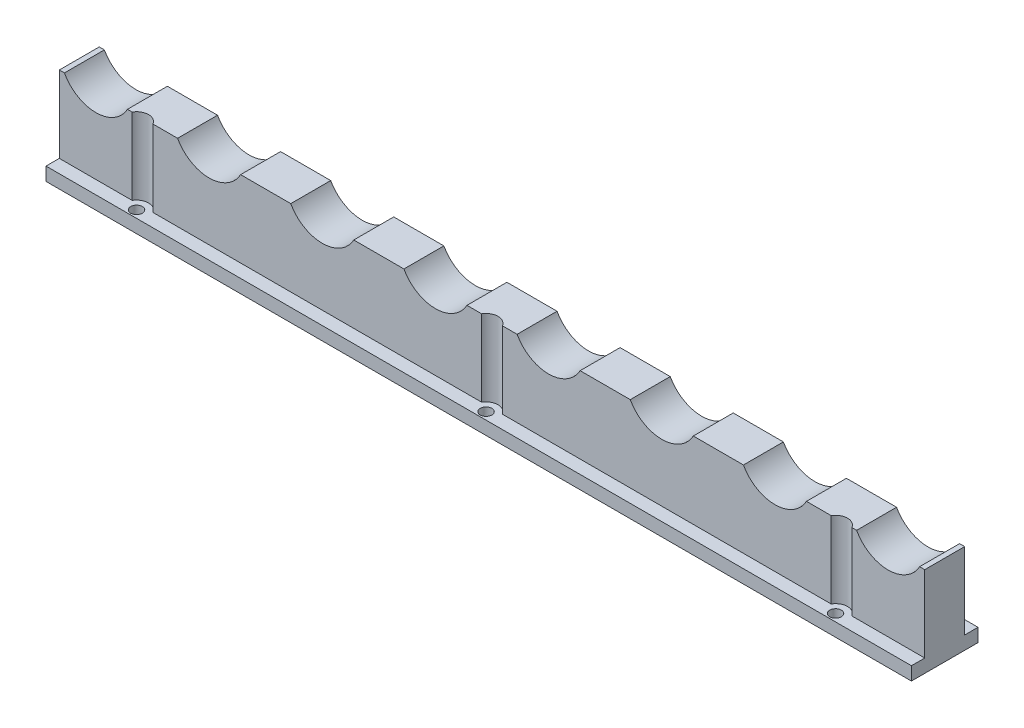
ISO-10303-21;
HEADER;
FILE_DESCRIPTION(('STEP AP214'),'2;1');
FILE_NAME('part.step','',(''),(''),'','','');
FILE_SCHEMA(('AUTOMOTIVE_DESIGN { 1 0 10303 214 1 1 1 1 }'));
ENDSEC;
DATA;
#1=APPLICATION_CONTEXT('core data for automotive mechanical design processes');
#2=APPLICATION_PROTOCOL_DEFINITION('international standard','automotive_design',2000,#1);
#3=PRODUCT_CONTEXT('',#1,'mechanical');
#4=PRODUCT('Part','Part','',(#3));
#5=PRODUCT_RELATED_PRODUCT_CATEGORY('part','',(#4));
#6=PRODUCT_DEFINITION_FORMATION('','',#4);
#7=PRODUCT_DEFINITION_CONTEXT('part definition',#1,'design');
#8=PRODUCT_DEFINITION('design','',#6,#7);
#9=PRODUCT_DEFINITION_SHAPE('','',#8);
#10=(LENGTH_UNIT() NAMED_UNIT(*) SI_UNIT(.MILLI.,.METRE.));
#11=(NAMED_UNIT(*) PLANE_ANGLE_UNIT() SI_UNIT($,.RADIAN.));
#12=(NAMED_UNIT(*) SI_UNIT($,.STERADIAN.) SOLID_ANGLE_UNIT());
#13=UNCERTAINTY_MEASURE_WITH_UNIT(LENGTH_MEASURE(1.E-05),#10,'distance_accuracy_value','');
#14=(GEOMETRIC_REPRESENTATION_CONTEXT(3) GLOBAL_UNCERTAINTY_ASSIGNED_CONTEXT((#13)) GLOBAL_UNIT_ASSIGNED_CONTEXT((#10,
#11,#12)) REPRESENTATION_CONTEXT('',''));
#15=CARTESIAN_POINT('',(0.,0.,0.));
#16=DIRECTION('',(0.,0.,1.));
#17=DIRECTION('',(1.,0.,0.));
#18=AXIS2_PLACEMENT_3D('',#15,#16,#17);
#19=CARTESIAN_POINT('',(0.,0.,30.));
#20=DIRECTION('',(0.,0.,-1.));
#21=DIRECTION('',(-1.,0.,0.));
#22=AXIS2_PLACEMENT_3D('',#19,#20,#21);
#23=PLANE('',#22);
#24=DIRECTION('',(1.,0.,0.));
#25=VECTOR('',#24,1.);
#26=CARTESIAN_POINT('',(-650.,20.,30.));
#27=LINE('',#26,#25);
#28=CARTESIAN_POINT('',(15.5884572681199,20.,30.));
#29=VERTEX_POINT('',#28);
#30=CARTESIAN_POINT('',(509.41154273188,20.,30.));
#31=VERTEX_POINT('',#30);
#32=EDGE_CURVE('E293',#29,#31,#27,.T.);
#33=ORIENTED_EDGE('',*,*,#32,.T.);
#34=DIRECTION('',(0.,1.,0.));
#35=VECTOR('',#34,1.);
#36=CARTESIAN_POINT('',(509.41154273188,135.,30.));
#37=LINE('',#36,#35);
#38=CARTESIAN_POINT('',(509.41154273188,135.,30.));
#39=VERTEX_POINT('',#38);
#40=EDGE_CURVE('E277',#31,#39,#37,.T.);
#41=ORIENTED_EDGE('',*,*,#40,.T.);
#42=DIRECTION('',(-1.,0.,0.));
#43=VECTOR('',#42,1.);
#44=CARTESIAN_POINT('',(-650.,135.,30.));
#45=LINE('',#44,#43);
#46=CARTESIAN_POINT('',(472.328638264797,135.,30.));
#47=VERTEX_POINT('',#46);
#48=EDGE_CURVE('E323',#39,#47,#45,.T.);
#49=ORIENTED_EDGE('',*,*,#48,.T.);
#50=CARTESIAN_POINT('',(425.,161.,30.));
#51=DIRECTION('',(0.,0.,-1.));
#52=DIRECTION('',(-1.,0.,0.));
#53=AXIS2_PLACEMENT_3D('',#50,#51,#52);
#54=CIRCLE('',#53,54.0000000000001);
#55=CARTESIAN_POINT('',(377.671361735203,135.,30.));
#56=VERTEX_POINT('',#55);
#57=EDGE_CURVE('E454',#47,#56,#54,.T.);
#58=ORIENTED_EDGE('',*,*,#57,.T.);
#59=CARTESIAN_POINT('',(302.328638264797,135.,30.));
#60=VERTEX_POINT('',#59);
#61=EDGE_CURVE('E576',#56,#60,#45,.T.);
#62=ORIENTED_EDGE('',*,*,#61,.T.);
#63=CARTESIAN_POINT('',(255.,161.,30.));
#64=DIRECTION('',(0.,0.,-1.));
#65=DIRECTION('',(-1.,0.,0.));
#66=AXIS2_PLACEMENT_3D('',#63,#64,#65);
#67=CIRCLE('',#66,54.0000000000001);
#68=CARTESIAN_POINT('',(207.671361735203,135.,30.));
#69=VERTEX_POINT('',#68);
#70=EDGE_CURVE('E459',#60,#69,#67,.T.);
#71=ORIENTED_EDGE('',*,*,#70,.T.);
#72=CARTESIAN_POINT('',(132.328638264797,135.,30.));
#73=VERTEX_POINT('',#72);
#74=EDGE_CURVE('E628',#69,#73,#45,.T.);
#75=ORIENTED_EDGE('',*,*,#74,.T.);
#76=CARTESIAN_POINT('',(85.0000000000001,161.,30.));
#77=DIRECTION('',(0.,0.,-1.));
#78=DIRECTION('',(-1.,0.,0.));
#79=AXIS2_PLACEMENT_3D('',#76,#77,#78);
#80=CIRCLE('',#79,54.0000000000001);
#81=CARTESIAN_POINT('',(37.6713617352031,135.,30.));
#82=VERTEX_POINT('',#81);
#83=EDGE_CURVE('E407',#73,#82,#80,.T.);
#84=ORIENTED_EDGE('',*,*,#83,.T.);
#85=CARTESIAN_POINT('',(15.5884572681199,135.,30.));
#86=VERTEX_POINT('',#85);
#87=EDGE_CURVE('E625',#82,#86,#45,.T.);
#88=ORIENTED_EDGE('',*,*,#87,.T.);
#89=DIRECTION('',(0.,1.,0.));
#90=VECTOR('',#89,1.);
#91=CARTESIAN_POINT('',(15.5884572681199,135.,30.));
#92=LINE('',#91,#90);
#93=EDGE_CURVE('E55',#86,#29,#92,.F.);
#94=ORIENTED_EDGE('',*,*,#93,.T.);
#95=EDGE_LOOP('',(#33,#41,#49,#58,#62,#71,#75,#84,#88,#94));
#96=FACE_BOUND('',#95,.T.);
#97=ADVANCED_FACE('F46',(#96),#23,.F.);
#98=CARTESIAN_POINT('',(-650.,20.,30.));
#99=DIRECTION('',(0.,-1.,0.));
#100=DIRECTION('',(1.,0.,0.));
#101=AXIS2_PLACEMENT_3D('',#98,#99,#100);
#102=PLANE('',#101);
#103=CARTESIAN_POINT('',(0.,20.,39.));
#104=DIRECTION('',(0.,1.,0.));
#105=DIRECTION('',(0.,0.,1.));
#106=AXIS2_PLACEMENT_3D('',#103,#104,#105);
#107=CIRCLE('',#106,8.74999999999998);
#108=CARTESIAN_POINT('',(0.,20.,47.75));
#109=VERTEX_POINT('',#108);
#110=EDGE_CURVE('E593',#109,#109,#107,.T.);
#111=ORIENTED_EDGE('',*,*,#110,.F.);
#112=EDGE_LOOP('',(#111));
#113=FACE_BOUND('',#112,.T.);
#114=CARTESIAN_POINT('',(-525.,20.,39.));
#115=DIRECTION('',(0.,1.,0.));
#116=DIRECTION('',(0.,0.,1.));
#117=AXIS2_PLACEMENT_3D('',#114,#115,#116);
#118=CIRCLE('',#117,8.74999999999993);
#119=CARTESIAN_POINT('',(-525.,20.,47.7499999999999));
#120=VERTEX_POINT('',#119);
#121=EDGE_CURVE('E488',#120,#120,#118,.T.);
#122=ORIENTED_EDGE('',*,*,#121,.F.);
#123=EDGE_LOOP('',(#122));
#124=FACE_BOUND('',#123,.T.);
#125=DIRECTION('',(1.,0.,0.));
#126=VECTOR('',#125,1.);
#127=CARTESIAN_POINT('',(-650.,20.,50.));
#128=LINE('',#127,#126);
#129=CARTESIAN_POINT('',(-650.,20.,50.));
#130=VERTEX_POINT('',#129);
#131=CARTESIAN_POINT('',(650.,20.,50.));
#132=VERTEX_POINT('',#131);
#133=EDGE_CURVE('E325',#130,#132,#128,.T.);
#134=ORIENTED_EDGE('',*,*,#133,.T.);
#135=DIRECTION('',(0.,0.,1.));
#136=VECTOR('',#135,1.);
#137=CARTESIAN_POINT('',(650.,20.,30.));
#138=LINE('',#137,#136);
#139=CARTESIAN_POINT('',(650.,20.,30.));
#140=VERTEX_POINT('',#139);
#141=EDGE_CURVE('E328',#140,#132,#138,.T.);
#142=ORIENTED_EDGE('',*,*,#141,.F.);
#143=CARTESIAN_POINT('',(540.58845726812,20.,30.));
#144=VERTEX_POINT('',#143);
#145=EDGE_CURVE('E295',#144,#140,#27,.T.);
#146=ORIENTED_EDGE('',*,*,#145,.F.);
#147=CARTESIAN_POINT('',(525.,20.,39.));
#148=DIRECTION('',(0.,1.,0.));
#149=DIRECTION('',(0.,0.,1.));
#150=AXIS2_PLACEMENT_3D('',#147,#148,#149);
#151=CIRCLE('',#150,18.);
#152=EDGE_CURVE('E65',#144,#31,#151,.T.);
#153=ORIENTED_EDGE('',*,*,#152,.T.);
#154=ORIENTED_EDGE('',*,*,#32,.F.);
#155=CARTESIAN_POINT('',(0.,20.,39.));
#156=DIRECTION('',(0.,1.,0.));
#157=DIRECTION('',(0.,0.,1.));
#158=AXIS2_PLACEMENT_3D('',#155,#156,#157);
#159=CIRCLE('',#158,18.);
#160=CARTESIAN_POINT('',(-15.5884572681199,20.,30.));
#161=VERTEX_POINT('',#160);
#162=EDGE_CURVE('E76',#29,#161,#159,.T.);
#163=ORIENTED_EDGE('',*,*,#162,.T.);
#164=CARTESIAN_POINT('',(-509.41154273188,20.,30.));
#165=VERTEX_POINT('',#164);
#166=EDGE_CURVE('E301',#165,#161,#27,.T.);
#167=ORIENTED_EDGE('',*,*,#166,.F.);
#168=CARTESIAN_POINT('',(-525.,20.,39.));
#169=DIRECTION('',(0.,1.,0.));
#170=DIRECTION('',(0.,0.,1.));
#171=AXIS2_PLACEMENT_3D('',#168,#169,#170);
#172=CIRCLE('',#171,18.);
#173=CARTESIAN_POINT('',(-540.58845726812,20.,30.));
#174=VERTEX_POINT('',#173);
#175=EDGE_CURVE('E485',#165,#174,#172,.T.);
#176=ORIENTED_EDGE('',*,*,#175,.T.);
#177=CARTESIAN_POINT('',(-650.,20.,30.));
#178=VERTEX_POINT('',#177);
#179=EDGE_CURVE('E307',#178,#174,#27,.T.);
#180=ORIENTED_EDGE('',*,*,#179,.F.);
#181=DIRECTION('',(0.,0.,1.));
#182=VECTOR('',#181,1.);
#183=CARTESIAN_POINT('',(-650.,20.,30.));
#184=LINE('',#183,#182);
#185=EDGE_CURVE('E321',#178,#130,#184,.T.);
#186=ORIENTED_EDGE('',*,*,#185,.T.);
#187=EDGE_LOOP('',(#134,#142,#146,#153,#154,#163,#167,#176,#180,#186));
#188=FACE_BOUND('',#187,.T.);
#189=CARTESIAN_POINT('',(525.,20.,39.));
#190=DIRECTION('',(0.,1.,0.));
#191=DIRECTION('',(0.,0.,1.));
#192=AXIS2_PLACEMENT_3D('',#189,#190,#191);
#193=CIRCLE('',#192,8.74999999999993);
#194=CARTESIAN_POINT('',(525.,20.,47.7499999999999));
#195=VERTEX_POINT('',#194);
#196=EDGE_CURVE('E297',#195,#195,#193,.T.);
#197=ORIENTED_EDGE('',*,*,#196,.F.);
#198=EDGE_LOOP('',(#197));
#199=FACE_BOUND('',#198,.T.);
#200=ADVANCED_FACE('F291',(#113,#124,#188,#199),#102,.F.);
#201=CARTESIAN_POINT('',(-650.,0.,-50.));
#202=DIRECTION('',(0.,-1.,0.));
#203=DIRECTION('',(0.,0.,-1.));
#204=AXIS2_PLACEMENT_3D('',#201,#202,#203);
#205=PLANE('',#204);
#206=CARTESIAN_POINT('',(525.,0.,39.));
#207=DIRECTION('',(0.,1.,0.));
#208=DIRECTION('',(0.,0.,1.));
#209=AXIS2_PLACEMENT_3D('',#206,#207,#208);
#210=CIRCLE('',#209,8.74999999999993);
#211=CARTESIAN_POINT('',(525.,0.,47.7499999999999));
#212=VERTEX_POINT('',#211);
#213=EDGE_CURVE('E572',#212,#212,#210,.T.);
#214=ORIENTED_EDGE('',*,*,#213,.T.);
#215=EDGE_LOOP('',(#214));
#216=FACE_BOUND('',#215,.T.);
#217=DIRECTION('',(1.,0.,0.));
#218=VECTOR('',#217,1.);
#219=CARTESIAN_POINT('',(-650.,0.,50.));
#220=LINE('',#219,#218);
#221=CARTESIAN_POINT('',(-650.,0.,50.));
#222=VERTEX_POINT('',#221);
#223=CARTESIAN_POINT('',(650.,0.,50.));
#224=VERTEX_POINT('',#223);
#225=EDGE_CURVE('E345',#222,#224,#220,.T.);
#226=ORIENTED_EDGE('',*,*,#225,.F.);
#227=DIRECTION('',(0.,0.,1.));
#228=VECTOR('',#227,1.);
#229=CARTESIAN_POINT('',(-650.,0.,-50.));
#230=LINE('',#229,#228);
#231=CARTESIAN_POINT('',(-650.,0.,-50.));
#232=VERTEX_POINT('',#231);
#233=EDGE_CURVE('E343',#232,#222,#230,.T.);
#234=ORIENTED_EDGE('',*,*,#233,.F.);
#235=DIRECTION('',(1.,0.,0.));
#236=VECTOR('',#235,1.);
#237=CARTESIAN_POINT('',(-650.,0.,-50.));
#238=LINE('',#237,#236);
#239=CARTESIAN_POINT('',(650.,0.,-50.));
#240=VERTEX_POINT('',#239);
#241=EDGE_CURVE('E335',#232,#240,#238,.T.);
#242=ORIENTED_EDGE('',*,*,#241,.T.);
#243=DIRECTION('',(0.,0.,1.));
#244=VECTOR('',#243,1.);
#245=CARTESIAN_POINT('',(650.,0.,-50.));
#246=LINE('',#245,#244);
#247=EDGE_CURVE('E358',#240,#224,#246,.T.);
#248=ORIENTED_EDGE('',*,*,#247,.T.);
#249=EDGE_LOOP('',(#226,#234,#242,#248));
#250=FACE_BOUND('',#249,.T.);
#251=CARTESIAN_POINT('',(-525.,0.,39.));
#252=DIRECTION('',(0.,1.,0.));
#253=DIRECTION('',(0.,0.,1.));
#254=AXIS2_PLACEMENT_3D('',#251,#252,#253);
#255=CIRCLE('',#254,8.74999999999993);
#256=CARTESIAN_POINT('',(-525.,0.,47.7499999999999));
#257=VERTEX_POINT('',#256);
#258=EDGE_CURVE('E491',#257,#257,#255,.T.);
#259=ORIENTED_EDGE('',*,*,#258,.T.);
#260=EDGE_LOOP('',(#259));
#261=FACE_BOUND('',#260,.T.);
#262=CARTESIAN_POINT('',(0.,0.,39.));
#263=DIRECTION('',(0.,1.,0.));
#264=DIRECTION('',(0.,0.,1.));
#265=AXIS2_PLACEMENT_3D('',#262,#263,#264);
#266=CIRCLE('',#265,8.74999999999997);
#267=CARTESIAN_POINT('',(0.,0.,47.75));
#268=VERTEX_POINT('',#267);
#269=EDGE_CURVE('E449',#268,#268,#266,.T.);
#270=ORIENTED_EDGE('',*,*,#269,.T.);
#271=EDGE_LOOP('',(#270));
#272=FACE_BOUND('',#271,.T.);
#273=ADVANCED_FACE('F533',(#216,#250,#261,#272),#205,.T.);
#274=ORIENTED_EDGE('',*,*,#166,.T.);
#275=DIRECTION('',(0.,1.,0.));
#276=VECTOR('',#275,1.);
#277=CARTESIAN_POINT('',(-15.5884572681199,135.,30.));
#278=LINE('',#277,#276);
#279=CARTESIAN_POINT('',(-15.5884572681199,135.,30.));
#280=VERTEX_POINT('',#279);
#281=EDGE_CURVE('E12',#161,#280,#278,.T.);
#282=ORIENTED_EDGE('',*,*,#281,.T.);
#283=CARTESIAN_POINT('',(-37.6713617352029,135.,30.));
#284=VERTEX_POINT('',#283);
#285=EDGE_CURVE('E579',#280,#284,#45,.T.);
#286=ORIENTED_EDGE('',*,*,#285,.T.);
#287=CARTESIAN_POINT('',(-85.,161.,30.));
#288=DIRECTION('',(0.,0.,-1.));
#289=DIRECTION('',(-1.,0.,0.));
#290=AXIS2_PLACEMENT_3D('',#287,#288,#289);
#291=CIRCLE('',#290,54.0000000000001);
#292=CARTESIAN_POINT('',(-132.328638264797,135.,30.));
#293=VERTEX_POINT('',#292);
#294=EDGE_CURVE('E403',#284,#293,#291,.T.);
#295=ORIENTED_EDGE('',*,*,#294,.T.);
#296=CARTESIAN_POINT('',(-207.671361735203,135.,30.));
#297=VERTEX_POINT('',#296);
#298=EDGE_CURVE('E614',#293,#297,#45,.T.);
#299=ORIENTED_EDGE('',*,*,#298,.T.);
#300=CARTESIAN_POINT('',(-255.,161.,30.));
#301=DIRECTION('',(0.,0.,-1.));
#302=DIRECTION('',(-1.,0.,0.));
#303=AXIS2_PLACEMENT_3D('',#300,#301,#302);
#304=CIRCLE('',#303,54.0000000000001);
#305=CARTESIAN_POINT('',(-302.328638264797,135.,30.));
#306=VERTEX_POINT('',#305);
#307=EDGE_CURVE('E406',#297,#306,#304,.T.);
#308=ORIENTED_EDGE('',*,*,#307,.T.);
#309=CARTESIAN_POINT('',(-377.671361735203,135.,30.));
#310=VERTEX_POINT('',#309);
#311=EDGE_CURVE('E624',#306,#310,#45,.T.);
#312=ORIENTED_EDGE('',*,*,#311,.T.);
#313=CARTESIAN_POINT('',(-425.,161.,30.));
#314=DIRECTION('',(0.,0.,-1.));
#315=DIRECTION('',(-1.,0.,0.));
#316=AXIS2_PLACEMENT_3D('',#313,#314,#315);
#317=CIRCLE('',#316,54.0000000000001);
#318=CARTESIAN_POINT('',(-472.328638264797,135.,30.));
#319=VERTEX_POINT('',#318);
#320=EDGE_CURVE('E468',#310,#319,#317,.T.);
#321=ORIENTED_EDGE('',*,*,#320,.T.);
#322=CARTESIAN_POINT('',(-509.41154273188,135.,30.));
#323=VERTEX_POINT('',#322);
#324=EDGE_CURVE('E626',#319,#323,#45,.T.);
#325=ORIENTED_EDGE('',*,*,#324,.T.);
#326=DIRECTION('',(0.,1.,0.));
#327=VECTOR('',#326,1.);
#328=CARTESIAN_POINT('',(-509.41154273188,135.,30.));
#329=LINE('',#328,#327);
#330=EDGE_CURVE('E354',#323,#165,#329,.F.);
#331=ORIENTED_EDGE('',*,*,#330,.T.);
#332=EDGE_LOOP('',(#274,#282,#286,#295,#299,#308,#312,#321,#325,#331));
#333=FACE_BOUND('',#332,.T.);
#334=ADVANCED_FACE('F619',(#333),#23,.F.);
#335=CARTESIAN_POINT('',(-650.,135.,-50.));
#336=DIRECTION('',(0.,1.,0.));
#337=DIRECTION('',(0.,0.,1.));
#338=AXIS2_PLACEMENT_3D('',#335,#336,#337);
#339=PLANE('',#338);
#340=DIRECTION('',(0.,0.,1.));
#341=VECTOR('',#340,1.);
#342=CARTESIAN_POINT('',(-472.328638264797,135.,-50.));
#343=LINE('',#342,#341);
#344=CARTESIAN_POINT('',(-472.328638264797,135.,-30.));
#345=VERTEX_POINT('',#344);
#346=EDGE_CURVE('E455',#345,#319,#343,.T.);
#347=ORIENTED_EDGE('',*,*,#346,.F.);
#348=DIRECTION('',(-1.,0.,0.));
#349=VECTOR('',#348,1.);
#350=CARTESIAN_POINT('',(-650.,135.,-30.));
#351=LINE('',#350,#349);
#352=CARTESIAN_POINT('',(-547.671361735203,135.,-30.));
#353=VERTEX_POINT('',#352);
#354=EDGE_CURVE('E506',#345,#353,#351,.T.);
#355=ORIENTED_EDGE('',*,*,#354,.T.);
#356=DIRECTION('',(0.,0.,1.));
#357=VECTOR('',#356,1.);
#358=CARTESIAN_POINT('',(-547.671361735203,135.,-50.));
#359=LINE('',#358,#357);
#360=CARTESIAN_POINT('',(-547.671361735203,135.,30.));
#361=VERTEX_POINT('',#360);
#362=EDGE_CURVE('E471',#353,#361,#359,.T.);
#363=ORIENTED_EDGE('',*,*,#362,.T.);
#364=CARTESIAN_POINT('',(-540.58845726812,135.,30.));
#365=VERTEX_POINT('',#364);
#366=EDGE_CURVE('E324',#365,#361,#45,.T.);
#367=ORIENTED_EDGE('',*,*,#366,.F.);
#368=CARTESIAN_POINT('',(-525.,135.,39.));
#369=DIRECTION('',(0.,1.,0.));
#370=DIRECTION('',(0.,0.,1.));
#371=AXIS2_PLACEMENT_3D('',#368,#369,#370);
#372=CIRCLE('',#371,18.);
#373=EDGE_CURVE('E482',#323,#365,#372,.T.);
#374=ORIENTED_EDGE('',*,*,#373,.F.);
#375=ORIENTED_EDGE('',*,*,#324,.F.);
#376=EDGE_LOOP('',(#347,#355,#363,#367,#374,#375));
#377=FACE_BOUND('',#376,.T.);
#378=ADVANCED_FACE('F664',(#377),#339,.T.);
#379=DIRECTION('',(0.,0.,1.));
#380=VECTOR('',#379,1.);
#381=CARTESIAN_POINT('',(-377.671361735203,135.,-50.));
#382=LINE('',#381,#380);
#383=CARTESIAN_POINT('',(-377.671361735203,135.,-30.));
#384=VERTEX_POINT('',#383);
#385=EDGE_CURVE('E566',#384,#310,#382,.T.);
#386=ORIENTED_EDGE('',*,*,#385,.T.);
#387=ORIENTED_EDGE('',*,*,#311,.F.);
#388=DIRECTION('',(0.,0.,1.));
#389=VECTOR('',#388,1.);
#390=CARTESIAN_POINT('',(-302.328638264797,135.,-50.));
#391=LINE('',#390,#389);
#392=CARTESIAN_POINT('',(-302.328638264797,135.,-30.));
#393=VERTEX_POINT('',#392);
#394=EDGE_CURVE('E603',#393,#306,#391,.T.);
#395=ORIENTED_EDGE('',*,*,#394,.F.);
#396=EDGE_CURVE('E565',#393,#384,#351,.T.);
#397=ORIENTED_EDGE('',*,*,#396,.T.);
#398=EDGE_LOOP('',(#386,#387,#395,#397));
#399=FACE_BOUND('',#398,.T.);
#400=ADVANCED_FACE('F658',(#399),#339,.T.);
#401=DIRECTION('',(0.,0.,1.));
#402=VECTOR('',#401,1.);
#403=CARTESIAN_POINT('',(-207.671361735203,135.,-50.));
#404=LINE('',#403,#402);
#405=CARTESIAN_POINT('',(-207.671361735203,135.,-30.));
#406=VERTEX_POINT('',#405);
#407=EDGE_CURVE('E418',#406,#297,#404,.T.);
#408=ORIENTED_EDGE('',*,*,#407,.T.);
#409=ORIENTED_EDGE('',*,*,#298,.F.);
#410=DIRECTION('',(0.,0.,1.));
#411=VECTOR('',#410,1.);
#412=CARTESIAN_POINT('',(-132.328638264797,135.,-50.));
#413=LINE('',#412,#411);
#414=CARTESIAN_POINT('',(-132.328638264797,135.,-30.));
#415=VERTEX_POINT('',#414);
#416=EDGE_CURVE('E411',#415,#293,#413,.T.);
#417=ORIENTED_EDGE('',*,*,#416,.F.);
#418=EDGE_CURVE('E616',#415,#406,#351,.T.);
#419=ORIENTED_EDGE('',*,*,#418,.T.);
#420=EDGE_LOOP('',(#408,#409,#417,#419));
#421=FACE_BOUND('',#420,.T.);
#422=ADVANCED_FACE('F612',(#421),#339,.T.);
#423=CARTESIAN_POINT('',(0.,135.,39.));
#424=DIRECTION('',(0.,1.,0.));
#425=DIRECTION('',(0.,0.,1.));
#426=AXIS2_PLACEMENT_3D('',#423,#424,#425);
#427=CIRCLE('',#426,18.);
#428=EDGE_CURVE('E285',#86,#280,#427,.T.);
#429=ORIENTED_EDGE('',*,*,#428,.F.);
#430=ORIENTED_EDGE('',*,*,#87,.F.);
#431=DIRECTION('',(0.,0.,1.));
#432=VECTOR('',#431,1.);
#433=CARTESIAN_POINT('',(37.6713617352031,135.,-50.));
#434=LINE('',#433,#432);
#435=CARTESIAN_POINT('',(37.6713617352031,135.,-30.));
#436=VERTEX_POINT('',#435);
#437=EDGE_CURVE('E412',#436,#82,#434,.T.);
#438=ORIENTED_EDGE('',*,*,#437,.F.);
#439=CARTESIAN_POINT('',(-37.6713617352029,135.,-30.));
#440=VERTEX_POINT('',#439);
#441=EDGE_CURVE('E401',#436,#440,#351,.T.);
#442=ORIENTED_EDGE('',*,*,#441,.T.);
#443=DIRECTION('',(0.,0.,1.));
#444=VECTOR('',#443,1.);
#445=CARTESIAN_POINT('',(-37.6713617352029,135.,-50.));
#446=LINE('',#445,#444);
#447=EDGE_CURVE('E409',#440,#284,#446,.T.);
#448=ORIENTED_EDGE('',*,*,#447,.T.);
#449=ORIENTED_EDGE('',*,*,#285,.F.);
#450=EDGE_LOOP('',(#429,#430,#438,#442,#448,#449));
#451=FACE_BOUND('',#450,.T.);
#452=ADVANCED_FACE('F737',(#451),#339,.T.);
#453=DIRECTION('',(0.,0.,1.));
#454=VECTOR('',#453,1.);
#455=CARTESIAN_POINT('',(132.328638264797,135.,-50.));
#456=LINE('',#455,#454);
#457=CARTESIAN_POINT('',(132.328638264797,135.,-30.));
#458=VERTEX_POINT('',#457);
#459=EDGE_CURVE('E421',#458,#73,#456,.T.);
#460=ORIENTED_EDGE('',*,*,#459,.T.);
#461=ORIENTED_EDGE('',*,*,#74,.F.);
#462=DIRECTION('',(0.,0.,1.));
#463=VECTOR('',#462,1.);
#464=CARTESIAN_POINT('',(207.671361735203,135.,-50.));
#465=LINE('',#464,#463);
#466=CARTESIAN_POINT('',(207.671361735203,135.,-30.));
#467=VERTEX_POINT('',#466);
#468=EDGE_CURVE('E428',#467,#69,#465,.T.);
#469=ORIENTED_EDGE('',*,*,#468,.F.);
#470=EDGE_CURVE('E647',#467,#458,#351,.T.);
#471=ORIENTED_EDGE('',*,*,#470,.T.);
#472=EDGE_LOOP('',(#460,#461,#469,#471));
#473=FACE_BOUND('',#472,.T.);
#474=ADVANCED_FACE('F743',(#473),#339,.T.);
#475=DIRECTION('',(0.,0.,1.));
#476=VECTOR('',#475,1.);
#477=CARTESIAN_POINT('',(302.328638264797,135.,-50.));
#478=LINE('',#477,#476);
#479=CARTESIAN_POINT('',(302.328638264797,135.,-30.));
#480=VERTEX_POINT('',#479);
#481=EDGE_CURVE('E431',#480,#60,#478,.T.);
#482=ORIENTED_EDGE('',*,*,#481,.T.);
#483=ORIENTED_EDGE('',*,*,#61,.F.);
#484=DIRECTION('',(0.,0.,1.));
#485=VECTOR('',#484,1.);
#486=CARTESIAN_POINT('',(377.671361735203,135.,-50.));
#487=LINE('',#486,#485);
#488=CARTESIAN_POINT('',(377.671361735203,135.,-30.));
#489=VERTEX_POINT('',#488);
#490=EDGE_CURVE('E435',#489,#56,#487,.T.);
#491=ORIENTED_EDGE('',*,*,#490,.F.);
#492=EDGE_CURVE('E570',#489,#480,#351,.T.);
#493=ORIENTED_EDGE('',*,*,#492,.T.);
#494=EDGE_LOOP('',(#482,#483,#491,#493));
#495=FACE_BOUND('',#494,.T.);
#496=ADVANCED_FACE('F639',(#495),#339,.T.);
#497=CARTESIAN_POINT('',(525.,135.,39.));
#498=DIRECTION('',(0.,1.,0.));
#499=DIRECTION('',(0.,0.,1.));
#500=AXIS2_PLACEMENT_3D('',#497,#498,#499);
#501=CIRCLE('',#500,18.);
#502=CARTESIAN_POINT('',(540.58845726812,135.,30.));
#503=VERTEX_POINT('',#502);
#504=EDGE_CURVE('E280',#503,#39,#501,.T.);
#505=ORIENTED_EDGE('',*,*,#504,.F.);
#506=CARTESIAN_POINT('',(547.671361735203,135.,30.));
#507=VERTEX_POINT('',#506);
#508=EDGE_CURVE('E322',#507,#503,#45,.T.);
#509=ORIENTED_EDGE('',*,*,#508,.F.);
#510=DIRECTION('',(0.,0.,1.));
#511=VECTOR('',#510,1.);
#512=CARTESIAN_POINT('',(547.671361735203,135.,-50.));
#513=LINE('',#512,#511);
#514=CARTESIAN_POINT('',(547.671361735203,135.,-30.));
#515=VERTEX_POINT('',#514);
#516=EDGE_CURVE('E442',#515,#507,#513,.T.);
#517=ORIENTED_EDGE('',*,*,#516,.F.);
#518=CARTESIAN_POINT('',(472.328638264797,135.,-30.));
#519=VERTEX_POINT('',#518);
#520=EDGE_CURVE('E505',#515,#519,#351,.T.);
#521=ORIENTED_EDGE('',*,*,#520,.T.);
#522=DIRECTION('',(0.,0.,1.));
#523=VECTOR('',#522,1.);
#524=CARTESIAN_POINT('',(472.328638264797,135.,-50.));
#525=LINE('',#524,#523);
#526=EDGE_CURVE('E438',#519,#47,#525,.T.);
#527=ORIENTED_EDGE('',*,*,#526,.T.);
#528=ORIENTED_EDGE('',*,*,#48,.F.);
#529=EDGE_LOOP('',(#505,#509,#517,#521,#527,#528));
#530=FACE_BOUND('',#529,.T.);
#531=ADVANCED_FACE('F678',(#530),#339,.T.);
#532=DIRECTION('',(0.,0.,1.));
#533=VECTOR('',#532,1.);
#534=CARTESIAN_POINT('',(-642.328638264797,135.,-50.));
#535=LINE('',#534,#533);
#536=CARTESIAN_POINT('',(-642.328638264797,135.,-30.));
#537=VERTEX_POINT('',#536);
#538=CARTESIAN_POINT('',(-642.328638264797,135.,30.));
#539=VERTEX_POINT('',#538);
#540=EDGE_CURVE('E472',#537,#539,#535,.T.);
#541=ORIENTED_EDGE('',*,*,#540,.F.);
#542=CARTESIAN_POINT('',(-650.,135.,-30.));
#543=VERTEX_POINT('',#542);
#544=EDGE_CURVE('E499',#537,#543,#351,.T.);
#545=ORIENTED_EDGE('',*,*,#544,.T.);
#546=DIRECTION('',(0.,0.,1.));
#547=VECTOR('',#546,1.);
#548=CARTESIAN_POINT('',(-650.,135.,-50.));
#549=LINE('',#548,#547);
#550=CARTESIAN_POINT('',(-650.,135.,30.));
#551=VERTEX_POINT('',#550);
#552=EDGE_CURVE('E350',#543,#551,#549,.T.);
#553=ORIENTED_EDGE('',*,*,#552,.T.);
#554=EDGE_CURVE('E317',#539,#551,#45,.T.);
#555=ORIENTED_EDGE('',*,*,#554,.F.);
#556=EDGE_LOOP('',(#541,#545,#553,#555));
#557=FACE_BOUND('',#556,.T.);
#558=ADVANCED_FACE('F676',(#557),#339,.T.);
#559=ORIENTED_EDGE('',*,*,#366,.T.);
#560=CARTESIAN_POINT('',(-595.,161.,30.));
#561=DIRECTION('',(0.,0.,-1.));
#562=DIRECTION('',(-1.,0.,0.));
#563=AXIS2_PLACEMENT_3D('',#560,#561,#562);
#564=CIRCLE('',#563,54.0000000000001);
#565=EDGE_CURVE('E475',#361,#539,#564,.T.);
#566=ORIENTED_EDGE('',*,*,#565,.T.);
#567=ORIENTED_EDGE('',*,*,#554,.T.);
#568=DIRECTION('',(0.,-1.,0.));
#569=VECTOR('',#568,1.);
#570=CARTESIAN_POINT('',(-650.,20.,30.));
#571=LINE('',#570,#569);
#572=EDGE_CURVE('E309',#551,#178,#571,.T.);
#573=ORIENTED_EDGE('',*,*,#572,.T.);
#574=ORIENTED_EDGE('',*,*,#179,.T.);
#575=DIRECTION('',(0.,1.,0.));
#576=VECTOR('',#575,1.);
#577=CARTESIAN_POINT('',(-540.58845726812,135.,30.));
#578=LINE('',#577,#576);
#579=EDGE_CURVE('E364',#174,#365,#578,.T.);
#580=ORIENTED_EDGE('',*,*,#579,.T.);
#581=EDGE_LOOP('',(#559,#566,#567,#573,#574,#580));
#582=FACE_BOUND('',#581,.T.);
#583=ADVANCED_FACE('F670',(#582),#23,.F.);
#584=CARTESIAN_POINT('',(-650.,0.,-50.));
#585=DIRECTION('',(-1.,0.,0.));
#586=DIRECTION('',(0.,0.,1.));
#587=AXIS2_PLACEMENT_3D('',#584,#585,#586);
#588=PLANE('',#587);
#589=DIRECTION('',(0.,-1.,0.));
#590=VECTOR('',#589,1.);
#591=CARTESIAN_POINT('',(-650.,20.,-30.));
#592=LINE('',#591,#590);
#593=CARTESIAN_POINT('',(-650.,20.,-30.));
#594=VERTEX_POINT('',#593);
#595=EDGE_CURVE('E495',#543,#594,#592,.T.);
#596=ORIENTED_EDGE('',*,*,#595,.T.);
#597=DIRECTION('',(0.,0.,-1.));
#598=VECTOR('',#597,1.);
#599=CARTESIAN_POINT('',(-650.,20.,-30.));
#600=LINE('',#599,#598);
#601=CARTESIAN_POINT('',(-650.,20.,-50.));
#602=VERTEX_POINT('',#601);
#603=EDGE_CURVE('E327',#594,#602,#600,.T.);
#604=ORIENTED_EDGE('',*,*,#603,.T.);
#605=DIRECTION('',(0.,-1.,0.));
#606=VECTOR('',#605,1.);
#607=CARTESIAN_POINT('',(-650.,0.,-50.));
#608=LINE('',#607,#606);
#609=EDGE_CURVE('E333',#602,#232,#608,.T.);
#610=ORIENTED_EDGE('',*,*,#609,.T.);
#611=ORIENTED_EDGE('',*,*,#233,.T.);
#612=DIRECTION('',(0.,-1.,0.));
#613=VECTOR('',#612,1.);
#614=CARTESIAN_POINT('',(-650.,0.,50.));
#615=LINE('',#614,#613);
#616=EDGE_CURVE('E331',#130,#222,#615,.T.);
#617=ORIENTED_EDGE('',*,*,#616,.F.);
#618=ORIENTED_EDGE('',*,*,#185,.F.);
#619=ORIENTED_EDGE('',*,*,#572,.F.);
#620=ORIENTED_EDGE('',*,*,#552,.F.);
#621=EDGE_LOOP('',(#596,#604,#610,#611,#617,#618,#619,#620));
#622=FACE_BOUND('',#621,.T.);
#623=ADVANCED_FACE('F48',(#622),#588,.T.);
#624=CARTESIAN_POINT('',(650.,0.,-50.));
#625=DIRECTION('',(1.,0.,0.));
#626=DIRECTION('',(0.,0.,-1.));
#627=AXIS2_PLACEMENT_3D('',#624,#625,#626);
#628=PLANE('',#627);
#629=DIRECTION('',(0.,1.,0.));
#630=VECTOR('',#629,1.);
#631=CARTESIAN_POINT('',(650.,0.,-50.));
#632=LINE('',#631,#630);
#633=CARTESIAN_POINT('',(650.,20.,-50.));
#634=VERTEX_POINT('',#633);
#635=EDGE_CURVE('E340',#240,#634,#632,.T.);
#636=ORIENTED_EDGE('',*,*,#635,.T.);
#637=DIRECTION('',(0.,0.,-1.));
#638=VECTOR('',#637,1.);
#639=CARTESIAN_POINT('',(650.,20.,-30.));
#640=LINE('',#639,#638);
#641=CARTESIAN_POINT('',(650.,20.,-30.));
#642=VERTEX_POINT('',#641);
#643=EDGE_CURVE('E513',#642,#634,#640,.T.);
#644=ORIENTED_EDGE('',*,*,#643,.F.);
#645=DIRECTION('',(0.,1.,0.));
#646=VECTOR('',#645,1.);
#647=CARTESIAN_POINT('',(650.,20.,-30.));
#648=LINE('',#647,#646);
#649=CARTESIAN_POINT('',(650.,135.,-30.));
#650=VERTEX_POINT('',#649);
#651=EDGE_CURVE('E504',#642,#650,#648,.T.);
#652=ORIENTED_EDGE('',*,*,#651,.T.);
#653=DIRECTION('',(0.,0.,1.));
#654=VECTOR('',#653,1.);
#655=CARTESIAN_POINT('',(650.,135.,-50.));
#656=LINE('',#655,#654);
#657=CARTESIAN_POINT('',(650.,135.,30.));
#658=VERTEX_POINT('',#657);
#659=EDGE_CURVE('E355',#650,#658,#656,.T.);
#660=ORIENTED_EDGE('',*,*,#659,.T.);
#661=DIRECTION('',(0.,1.,0.));
#662=VECTOR('',#661,1.);
#663=CARTESIAN_POINT('',(650.,20.,30.));
#664=LINE('',#663,#662);
#665=EDGE_CURVE('E313',#140,#658,#664,.T.);
#666=ORIENTED_EDGE('',*,*,#665,.F.);
#667=ORIENTED_EDGE('',*,*,#141,.T.);
#668=DIRECTION('',(0.,1.,0.));
#669=VECTOR('',#668,1.);
#670=CARTESIAN_POINT('',(650.,0.,50.));
#671=LINE('',#670,#669);
#672=EDGE_CURVE('E336',#224,#132,#671,.T.);
#673=ORIENTED_EDGE('',*,*,#672,.F.);
#674=ORIENTED_EDGE('',*,*,#247,.F.);
#675=EDGE_LOOP('',(#636,#644,#652,#660,#666,#667,#673,#674));
#676=FACE_BOUND('',#675,.T.);
#677=ADVANCED_FACE('F529',(#676),#628,.T.);
#678=CARTESIAN_POINT('',(0.,0.,-50.));
#679=DIRECTION('',(0.,0.,-1.));
#680=DIRECTION('',(-1.,0.,0.));
#681=AXIS2_PLACEMENT_3D('',#678,#679,#680);
#682=PLANE('',#681);
#683=ORIENTED_EDGE('',*,*,#609,.F.);
#684=DIRECTION('',(1.,0.,0.));
#685=VECTOR('',#684,1.);
#686=CARTESIAN_POINT('',(-650.,20.,-50.));
#687=LINE('',#686,#685);
#688=EDGE_CURVE('E494',#602,#634,#687,.T.);
#689=ORIENTED_EDGE('',*,*,#688,.T.);
#690=ORIENTED_EDGE('',*,*,#635,.F.);
#691=ORIENTED_EDGE('',*,*,#241,.F.);
#692=EDGE_LOOP('',(#683,#689,#690,#691));
#693=FACE_BOUND('',#692,.T.);
#694=ADVANCED_FACE('F527',(#693),#682,.T.);
#695=DIRECTION('',(0.,0.,1.));
#696=VECTOR('',#695,1.);
#697=CARTESIAN_POINT('',(642.328638264797,135.,-50.));
#698=LINE('',#697,#696);
#699=CARTESIAN_POINT('',(642.328638264797,135.,-30.));
#700=VERTEX_POINT('',#699);
#701=CARTESIAN_POINT('',(642.328638264797,135.,30.));
#702=VERTEX_POINT('',#701);
#703=EDGE_CURVE('E445',#700,#702,#698,.T.);
#704=ORIENTED_EDGE('',*,*,#703,.T.);
#705=EDGE_CURVE('E318',#658,#702,#45,.T.);
#706=ORIENTED_EDGE('',*,*,#705,.F.);
#707=ORIENTED_EDGE('',*,*,#659,.F.);
#708=EDGE_CURVE('E500',#650,#700,#351,.T.);
#709=ORIENTED_EDGE('',*,*,#708,.T.);
#710=EDGE_LOOP('',(#704,#706,#707,#709));
#711=FACE_BOUND('',#710,.T.);
#712=ADVANCED_FACE('F550',(#711),#339,.T.);
#713=CARTESIAN_POINT('',(0.,0.,50.));
#714=DIRECTION('',(0.,0.,-1.));
#715=DIRECTION('',(-1.,0.,0.));
#716=AXIS2_PLACEMENT_3D('',#713,#714,#715);
#717=PLANE('',#716);
#718=ORIENTED_EDGE('',*,*,#672,.T.);
#719=ORIENTED_EDGE('',*,*,#133,.F.);
#720=ORIENTED_EDGE('',*,*,#616,.T.);
#721=ORIENTED_EDGE('',*,*,#225,.T.);
#722=EDGE_LOOP('',(#718,#719,#720,#721));
#723=FACE_BOUND('',#722,.T.);
#724=ADVANCED_FACE('F557',(#723),#717,.F.);
#725=ORIENTED_EDGE('',*,*,#508,.T.);
#726=DIRECTION('',(0.,1.,0.));
#727=VECTOR('',#726,1.);
#728=CARTESIAN_POINT('',(540.58845726812,135.,30.));
#729=LINE('',#728,#727);
#730=EDGE_CURVE('E286',#503,#144,#729,.F.);
#731=ORIENTED_EDGE('',*,*,#730,.T.);
#732=ORIENTED_EDGE('',*,*,#145,.T.);
#733=ORIENTED_EDGE('',*,*,#665,.T.);
#734=ORIENTED_EDGE('',*,*,#705,.T.);
#735=CARTESIAN_POINT('',(595.,161.,30.));
#736=DIRECTION('',(0.,0.,-1.));
#737=DIRECTION('',(-1.,0.,0.));
#738=AXIS2_PLACEMENT_3D('',#735,#736,#737);
#739=CIRCLE('',#738,54.0000000000001);
#740=EDGE_CURVE('E450',#702,#507,#739,.T.);
#741=ORIENTED_EDGE('',*,*,#740,.T.);
#742=EDGE_LOOP('',(#725,#731,#732,#733,#734,#741));
#743=FACE_BOUND('',#742,.T.);
#744=ADVANCED_FACE('F553',(#743),#23,.F.);
#745=CARTESIAN_POINT('',(-650.,20.,-30.));
#746=DIRECTION('',(0.,1.,0.));
#747=DIRECTION('',(-1.,0.,0.));
#748=AXIS2_PLACEMENT_3D('',#745,#746,#747);
#749=PLANE('',#748);
#750=ORIENTED_EDGE('',*,*,#688,.F.);
#751=ORIENTED_EDGE('',*,*,#603,.F.);
#752=DIRECTION('',(1.,0.,0.));
#753=VECTOR('',#752,1.);
#754=CARTESIAN_POINT('',(-650.,20.,-30.));
#755=LINE('',#754,#753);
#756=EDGE_CURVE('E510',#594,#642,#755,.T.);
#757=ORIENTED_EDGE('',*,*,#756,.T.);
#758=ORIENTED_EDGE('',*,*,#643,.T.);
#759=EDGE_LOOP('',(#750,#751,#757,#758));
#760=FACE_BOUND('',#759,.T.);
#761=ADVANCED_FACE('F520',(#760),#749,.T.);
#762=CARTESIAN_POINT('',(0.,0.,-30.));
#763=DIRECTION('',(0.,0.,1.));
#764=DIRECTION('',(-1.,0.,0.));
#765=AXIS2_PLACEMENT_3D('',#762,#763,#764);
#766=PLANE('',#765);
#767=ORIENTED_EDGE('',*,*,#354,.F.);
#768=CARTESIAN_POINT('',(-425.,161.,-30.));
#769=DIRECTION('',(0.,0.,1.));
#770=DIRECTION('',(1.,0.,0.));
#771=AXIS2_PLACEMENT_3D('',#768,#769,#770);
#772=CIRCLE('',#771,54.0000000000001);
#773=EDGE_CURVE('E395',#345,#384,#772,.T.);
#774=ORIENTED_EDGE('',*,*,#773,.T.);
#775=ORIENTED_EDGE('',*,*,#396,.F.);
#776=CARTESIAN_POINT('',(-255.,161.,-30.));
#777=DIRECTION('',(0.,0.,1.));
#778=DIRECTION('',(1.,0.,0.));
#779=AXIS2_PLACEMENT_3D('',#776,#777,#778);
#780=CIRCLE('',#779,54.0000000000001);
#781=EDGE_CURVE('E391',#393,#406,#780,.T.);
#782=ORIENTED_EDGE('',*,*,#781,.T.);
#783=ORIENTED_EDGE('',*,*,#418,.F.);
#784=CARTESIAN_POINT('',(-85.,161.,-30.));
#785=DIRECTION('',(0.,0.,1.));
#786=DIRECTION('',(1.,0.,0.));
#787=AXIS2_PLACEMENT_3D('',#784,#785,#786);
#788=CIRCLE('',#787,54.0000000000001);
#789=EDGE_CURVE('E387',#415,#440,#788,.T.);
#790=ORIENTED_EDGE('',*,*,#789,.T.);
#791=ORIENTED_EDGE('',*,*,#441,.F.);
#792=CARTESIAN_POINT('',(85.0000000000001,161.,-30.));
#793=DIRECTION('',(0.,0.,1.));
#794=DIRECTION('',(1.,0.,0.));
#795=AXIS2_PLACEMENT_3D('',#792,#793,#794);
#796=CIRCLE('',#795,54.0000000000001);
#797=EDGE_CURVE('E383',#436,#458,#796,.T.);
#798=ORIENTED_EDGE('',*,*,#797,.T.);
#799=ORIENTED_EDGE('',*,*,#470,.F.);
#800=CARTESIAN_POINT('',(255.,161.,-30.));
#801=DIRECTION('',(0.,0.,1.));
#802=DIRECTION('',(1.,0.,0.));
#803=AXIS2_PLACEMENT_3D('',#800,#801,#802);
#804=CIRCLE('',#803,54.0000000000001);
#805=EDGE_CURVE('E379',#467,#480,#804,.T.);
#806=ORIENTED_EDGE('',*,*,#805,.T.);
#807=ORIENTED_EDGE('',*,*,#492,.F.);
#808=CARTESIAN_POINT('',(425.,161.,-30.));
#809=DIRECTION('',(0.,0.,1.));
#810=DIRECTION('',(1.,0.,0.));
#811=AXIS2_PLACEMENT_3D('',#808,#809,#810);
#812=CIRCLE('',#811,54.0000000000001);
#813=EDGE_CURVE('E375',#489,#519,#812,.T.);
#814=ORIENTED_EDGE('',*,*,#813,.T.);
#815=ORIENTED_EDGE('',*,*,#520,.F.);
#816=CARTESIAN_POINT('',(595.,161.,-30.));
#817=DIRECTION('',(0.,0.,1.));
#818=DIRECTION('',(1.,0.,0.));
#819=AXIS2_PLACEMENT_3D('',#816,#817,#818);
#820=CIRCLE('',#819,54.0000000000001);
#821=EDGE_CURVE('E371',#515,#700,#820,.T.);
#822=ORIENTED_EDGE('',*,*,#821,.T.);
#823=ORIENTED_EDGE('',*,*,#708,.F.);
#824=ORIENTED_EDGE('',*,*,#651,.F.);
#825=ORIENTED_EDGE('',*,*,#756,.F.);
#826=ORIENTED_EDGE('',*,*,#595,.F.);
#827=ORIENTED_EDGE('',*,*,#544,.F.);
#828=CARTESIAN_POINT('',(-595.,161.,-30.));
#829=DIRECTION('',(0.,0.,1.));
#830=DIRECTION('',(1.,0.,0.));
#831=AXIS2_PLACEMENT_3D('',#828,#829,#830);
#832=CIRCLE('',#831,54.0000000000001);
#833=EDGE_CURVE('E367',#537,#353,#832,.T.);
#834=ORIENTED_EDGE('',*,*,#833,.T.);
#835=EDGE_LOOP('',(#767,#774,#775,#782,#783,#790,#791,#798,#799,#806,#807,#814,#815,#822,#823,
#824,#825,#826,#827,#834));
#836=FACE_BOUND('',#835,.T.);
#837=ADVANCED_FACE('F545',(#836),#766,.F.);
#838=CARTESIAN_POINT('',(-525.,135.,39.));
#839=DIRECTION('',(0.,1.,0.));
#840=DIRECTION('',(0.,0.,1.));
#841=AXIS2_PLACEMENT_3D('',#838,#839,#840);
#842=CYLINDRICAL_SURFACE('',#841,18.);
#843=ORIENTED_EDGE('',*,*,#175,.F.);
#844=ORIENTED_EDGE('',*,*,#330,.F.);
#845=ORIENTED_EDGE('',*,*,#373,.T.);
#846=ORIENTED_EDGE('',*,*,#579,.F.);
#847=EDGE_LOOP('',(#843,#844,#845,#846));
#848=FACE_BOUND('',#847,.T.);
#849=ADVANCED_FACE('F806',(#848),#842,.F.);
#850=CARTESIAN_POINT('',(-525.,135.,39.));
#851=DIRECTION('',(0.,1.,0.));
#852=DIRECTION('',(0.,0.,1.));
#853=AXIS2_PLACEMENT_3D('',#850,#851,#852);
#854=CYLINDRICAL_SURFACE('',#853,8.74999999999993);
#855=ORIENTED_EDGE('',*,*,#258,.F.);
#856=EDGE_LOOP('',(#855));
#857=FACE_BOUND('',#856,.T.);
#858=ORIENTED_EDGE('',*,*,#121,.T.);
#859=EDGE_LOOP('',(#858));
#860=FACE_BOUND('',#859,.T.);
#861=ADVANCED_FACE('F813',(#857,#860),#854,.F.);
#862=CARTESIAN_POINT('',(-595.,161.,-50.));
#863=DIRECTION('',(0.,0.,1.));
#864=DIRECTION('',(1.,0.,0.));
#865=AXIS2_PLACEMENT_3D('',#862,#863,#864);
#866=CYLINDRICAL_SURFACE('',#865,54.0000000000001);
#867=ORIENTED_EDGE('',*,*,#362,.F.);
#868=ORIENTED_EDGE('',*,*,#833,.F.);
#869=ORIENTED_EDGE('',*,*,#540,.T.);
#870=ORIENTED_EDGE('',*,*,#565,.F.);
#871=EDGE_LOOP('',(#867,#868,#869,#870));
#872=FACE_BOUND('',#871,.T.);
#873=ADVANCED_FACE('F673',(#872),#866,.F.);
#874=CARTESIAN_POINT('',(595.,161.,-50.));
#875=DIRECTION('',(0.,0.,1.));
#876=DIRECTION('',(1.,0.,0.));
#877=AXIS2_PLACEMENT_3D('',#874,#875,#876);
#878=CYLINDRICAL_SURFACE('',#877,54.0000000000001);
#879=ORIENTED_EDGE('',*,*,#703,.F.);
#880=ORIENTED_EDGE('',*,*,#821,.F.);
#881=ORIENTED_EDGE('',*,*,#516,.T.);
#882=ORIENTED_EDGE('',*,*,#740,.F.);
#883=EDGE_LOOP('',(#879,#880,#881,#882));
#884=FACE_BOUND('',#883,.T.);
#885=ADVANCED_FACE('F833',(#884),#878,.F.);
#886=CARTESIAN_POINT('',(425.,161.,-50.));
#887=DIRECTION('',(0.,0.,1.));
#888=DIRECTION('',(1.,0.,0.));
#889=AXIS2_PLACEMENT_3D('',#886,#887,#888);
#890=CYLINDRICAL_SURFACE('',#889,54.0000000000001);
#891=ORIENTED_EDGE('',*,*,#526,.F.);
#892=ORIENTED_EDGE('',*,*,#813,.F.);
#893=ORIENTED_EDGE('',*,*,#490,.T.);
#894=ORIENTED_EDGE('',*,*,#57,.F.);
#895=EDGE_LOOP('',(#891,#892,#893,#894));
#896=FACE_BOUND('',#895,.T.);
#897=ADVANCED_FACE('F843',(#896),#890,.F.);
#898=CARTESIAN_POINT('',(255.,161.,-50.));
#899=DIRECTION('',(0.,0.,1.));
#900=DIRECTION('',(1.,0.,0.));
#901=AXIS2_PLACEMENT_3D('',#898,#899,#900);
#902=CYLINDRICAL_SURFACE('',#901,54.0000000000001);
#903=ORIENTED_EDGE('',*,*,#481,.F.);
#904=ORIENTED_EDGE('',*,*,#805,.F.);
#905=ORIENTED_EDGE('',*,*,#468,.T.);
#906=ORIENTED_EDGE('',*,*,#70,.F.);
#907=EDGE_LOOP('',(#903,#904,#905,#906));
#908=FACE_BOUND('',#907,.T.);
#909=ADVANCED_FACE('F643',(#908),#902,.F.);
#910=CARTESIAN_POINT('',(85.0000000000001,161.,-50.));
#911=DIRECTION('',(0.,0.,1.));
#912=DIRECTION('',(1.,0.,0.));
#913=AXIS2_PLACEMENT_3D('',#910,#911,#912);
#914=CYLINDRICAL_SURFACE('',#913,54.0000000000001);
#915=ORIENTED_EDGE('',*,*,#459,.F.);
#916=ORIENTED_EDGE('',*,*,#797,.F.);
#917=ORIENTED_EDGE('',*,*,#437,.T.);
#918=ORIENTED_EDGE('',*,*,#83,.F.);
#919=EDGE_LOOP('',(#915,#916,#917,#918));
#920=FACE_BOUND('',#919,.T.);
#921=ADVANCED_FACE('F861',(#920),#914,.F.);
#922=CARTESIAN_POINT('',(-85.,161.,-50.));
#923=DIRECTION('',(0.,0.,1.));
#924=DIRECTION('',(1.,0.,0.));
#925=AXIS2_PLACEMENT_3D('',#922,#923,#924);
#926=CYLINDRICAL_SURFACE('',#925,54.0000000000001);
#927=ORIENTED_EDGE('',*,*,#447,.F.);
#928=ORIENTED_EDGE('',*,*,#789,.F.);
#929=ORIENTED_EDGE('',*,*,#416,.T.);
#930=ORIENTED_EDGE('',*,*,#294,.F.);
#931=EDGE_LOOP('',(#927,#928,#929,#930));
#932=FACE_BOUND('',#931,.T.);
#933=ADVANCED_FACE('F870',(#932),#926,.F.);
#934=CARTESIAN_POINT('',(-255.,161.,-50.));
#935=DIRECTION('',(0.,0.,1.));
#936=DIRECTION('',(1.,0.,0.));
#937=AXIS2_PLACEMENT_3D('',#934,#935,#936);
#938=CYLINDRICAL_SURFACE('',#937,54.0000000000001);
#939=ORIENTED_EDGE('',*,*,#407,.F.);
#940=ORIENTED_EDGE('',*,*,#781,.F.);
#941=ORIENTED_EDGE('',*,*,#394,.T.);
#942=ORIENTED_EDGE('',*,*,#307,.F.);
#943=EDGE_LOOP('',(#939,#940,#941,#942));
#944=FACE_BOUND('',#943,.T.);
#945=ADVANCED_FACE('F880',(#944),#938,.F.);
#946=CARTESIAN_POINT('',(-425.,161.,-50.));
#947=DIRECTION('',(0.,0.,1.));
#948=DIRECTION('',(1.,0.,0.));
#949=AXIS2_PLACEMENT_3D('',#946,#947,#948);
#950=CYLINDRICAL_SURFACE('',#949,54.0000000000001);
#951=ORIENTED_EDGE('',*,*,#385,.F.);
#952=ORIENTED_EDGE('',*,*,#773,.F.);
#953=ORIENTED_EDGE('',*,*,#346,.T.);
#954=ORIENTED_EDGE('',*,*,#320,.F.);
#955=EDGE_LOOP('',(#951,#952,#953,#954));
#956=FACE_BOUND('',#955,.T.);
#957=ADVANCED_FACE('F661',(#956),#950,.F.);
#958=CARTESIAN_POINT('',(0.,135.,39.));
#959=DIRECTION('',(0.,1.,0.));
#960=DIRECTION('',(0.,0.,1.));
#961=AXIS2_PLACEMENT_3D('',#958,#959,#960);
#962=CYLINDRICAL_SURFACE('',#961,8.74999999999997);
#963=ORIENTED_EDGE('',*,*,#269,.F.);
#964=EDGE_LOOP('',(#963));
#965=FACE_BOUND('',#964,.T.);
#966=ORIENTED_EDGE('',*,*,#110,.T.);
#967=EDGE_LOOP('',(#966));
#968=FACE_BOUND('',#967,.T.);
#969=ADVANCED_FACE('F898',(#965,#968),#962,.F.);
#970=CARTESIAN_POINT('',(0.,135.,39.));
#971=DIRECTION('',(0.,1.,0.));
#972=DIRECTION('',(0.,0.,1.));
#973=AXIS2_PLACEMENT_3D('',#970,#971,#972);
#974=CYLINDRICAL_SURFACE('',#973,18.);
#975=ORIENTED_EDGE('',*,*,#162,.F.);
#976=ORIENTED_EDGE('',*,*,#93,.F.);
#977=ORIENTED_EDGE('',*,*,#428,.T.);
#978=ORIENTED_EDGE('',*,*,#281,.F.);
#979=EDGE_LOOP('',(#975,#976,#977,#978));
#980=FACE_BOUND('',#979,.T.);
#981=ADVANCED_FACE('F765',(#980),#974,.F.);
#982=CARTESIAN_POINT('',(525.,135.,39.));
#983=DIRECTION('',(0.,1.,0.));
#984=DIRECTION('',(0.,0.,1.));
#985=AXIS2_PLACEMENT_3D('',#982,#983,#984);
#986=CYLINDRICAL_SURFACE('',#985,8.74999999999993);
#987=ORIENTED_EDGE('',*,*,#213,.F.);
#988=EDGE_LOOP('',(#987));
#989=FACE_BOUND('',#988,.T.);
#990=ORIENTED_EDGE('',*,*,#196,.T.);
#991=EDGE_LOOP('',(#990));
#992=FACE_BOUND('',#991,.T.);
#993=ADVANCED_FACE('F762',(#989,#992),#986,.F.);
#994=CARTESIAN_POINT('',(525.,135.,39.));
#995=DIRECTION('',(0.,1.,0.));
#996=DIRECTION('',(0.,0.,1.));
#997=AXIS2_PLACEMENT_3D('',#994,#995,#996);
#998=CYLINDRICAL_SURFACE('',#997,18.);
#999=ORIENTED_EDGE('',*,*,#152,.F.);
#1000=ORIENTED_EDGE('',*,*,#730,.F.);
#1001=ORIENTED_EDGE('',*,*,#504,.T.);
#1002=ORIENTED_EDGE('',*,*,#40,.F.);
#1003=EDGE_LOOP('',(#999,#1000,#1001,#1002));
#1004=FACE_BOUND('',#1003,.T.);
#1005=ADVANCED_FACE('F278',(#1004),#998,.F.);
#1006=CLOSED_SHELL('',(#97,#200,#273,#334,#378,#400,#422,#452,#474,#496,#531,#558,#583,#623,
#677,#694,#712,#724,#744,#761,#837,#849,#861,#873,#885,#897,#909,#921,#933,#945,#957,#969,#981,
#993,#1005));
#1007=MANIFOLD_SOLID_BREP('B2',#1006);
#1008=ADVANCED_BREP_SHAPE_REPRESENTATION('',(#18,#1007),#14);
#1009=SHAPE_DEFINITION_REPRESENTATION(#9,#1008);
ENDSEC;
END-ISO-10303-21;
